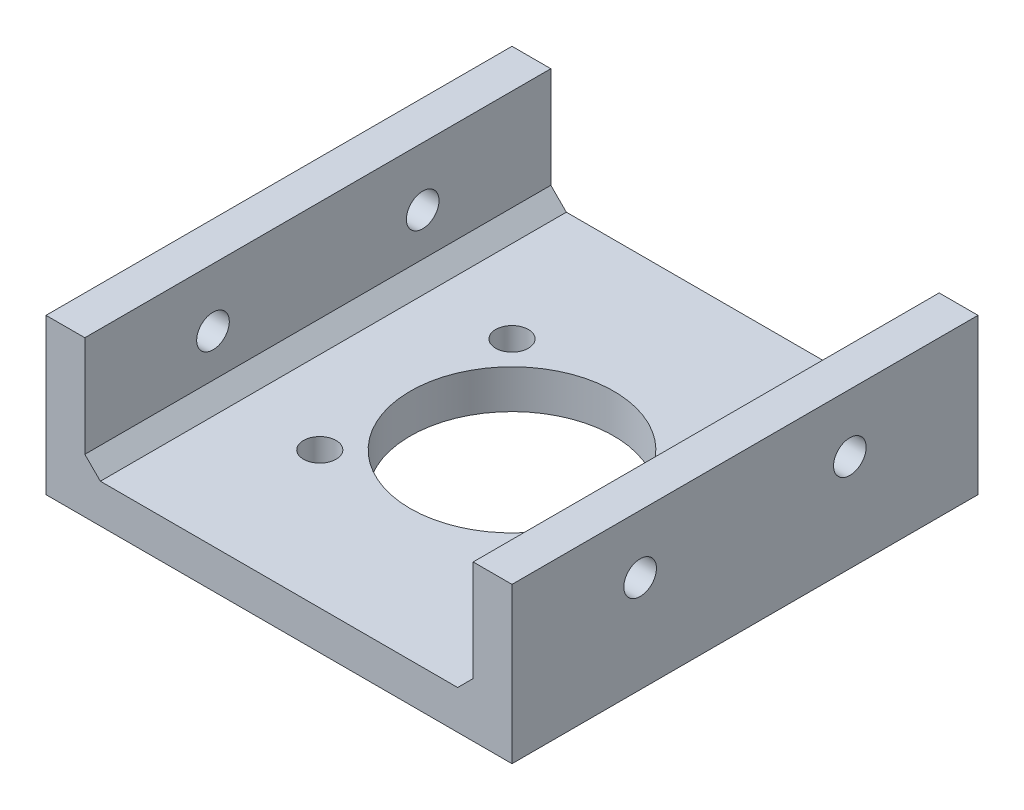
ISO-10303-21;
HEADER;
FILE_DESCRIPTION(('STEP AP214'),'2;1');
FILE_NAME('part.step','',(''),(''),'','','');
FILE_SCHEMA(('AUTOMOTIVE_DESIGN { 1 0 10303 214 1 1 1 1 }'));
ENDSEC;
DATA;
#1=APPLICATION_CONTEXT('core data for automotive mechanical design processes');
#2=APPLICATION_PROTOCOL_DEFINITION('international standard','automotive_design',2000,#1);
#3=PRODUCT_CONTEXT('',#1,'mechanical');
#4=PRODUCT('Part','Part','',(#3));
#5=PRODUCT_RELATED_PRODUCT_CATEGORY('part','',(#4));
#6=PRODUCT_DEFINITION_FORMATION('','',#4);
#7=PRODUCT_DEFINITION_CONTEXT('part definition',#1,'design');
#8=PRODUCT_DEFINITION('design','',#6,#7);
#9=PRODUCT_DEFINITION_SHAPE('','',#8);
#10=(LENGTH_UNIT() NAMED_UNIT(*) SI_UNIT(.MILLI.,.METRE.));
#11=(NAMED_UNIT(*) PLANE_ANGLE_UNIT() SI_UNIT($,.RADIAN.));
#12=(NAMED_UNIT(*) SI_UNIT($,.STERADIAN.) SOLID_ANGLE_UNIT());
#13=UNCERTAINTY_MEASURE_WITH_UNIT(LENGTH_MEASURE(1.E-05),#10,'distance_accuracy_value','');
#14=(GEOMETRIC_REPRESENTATION_CONTEXT(3) GLOBAL_UNCERTAINTY_ASSIGNED_CONTEXT((#13)) GLOBAL_UNIT_ASSIGNED_CONTEXT((#10,
#11,#12)) REPRESENTATION_CONTEXT('',''));
#15=CARTESIAN_POINT('',(0.,0.,0.));
#16=DIRECTION('',(0.,0.,1.));
#17=DIRECTION('',(1.,0.,0.));
#18=AXIS2_PLACEMENT_3D('',#15,#16,#17);
#19=CARTESIAN_POINT('',(0.,5.,0.));
#20=DIRECTION('',(0.,-1.,0.));
#21=DIRECTION('',(0.,0.,-1.));
#22=AXIS2_PLACEMENT_3D('',#19,#20,#21);
#23=PLANE('',#22);
#24=CARTESIAN_POINT('',(0.,5.,0.));
#25=DIRECTION('',(0.,1.,0.));
#26=DIRECTION('',(0.,0.,1.));
#27=AXIS2_PLACEMENT_3D('',#24,#25,#26);
#28=CIRCLE('',#27,13.1);
#29=CARTESIAN_POINT('',(0.,5.,13.1));
#30=VERTEX_POINT('',#29);
#31=EDGE_CURVE('E190',#30,#30,#28,.T.);
#32=ORIENTED_EDGE('',*,*,#31,.F.);
#33=EDGE_LOOP('',(#32));
#34=FACE_BOUND('',#33,.T.);
#35=CARTESIAN_POINT('',(-12.3743686707645,5.,12.3743686707647));
#36=DIRECTION('',(0.,1.,0.));
#37=DIRECTION('',(0.,0.,1.));
#38=AXIS2_PLACEMENT_3D('',#35,#36,#37);
#39=CIRCLE('',#38,2.1);
#40=CARTESIAN_POINT('',(-12.3743686707645,5.,14.4743686707647));
#41=VERTEX_POINT('',#40);
#42=EDGE_CURVE('E184',#41,#41,#39,.T.);
#43=ORIENTED_EDGE('',*,*,#42,.F.);
#44=EDGE_LOOP('',(#43));
#45=FACE_BOUND('',#44,.T.);
#46=CARTESIAN_POINT('',(12.3743686707645,5.,12.3743686707647));
#47=DIRECTION('',(0.,1.,0.));
#48=DIRECTION('',(0.,0.,-1.));
#49=AXIS2_PLACEMENT_3D('',#46,#47,#48);
#50=CIRCLE('',#49,2.1);
#51=CARTESIAN_POINT('',(12.3743686707645,5.,10.2743686707647));
#52=VERTEX_POINT('',#51);
#53=EDGE_CURVE('E178',#52,#52,#50,.T.);
#54=ORIENTED_EDGE('',*,*,#53,.F.);
#55=EDGE_LOOP('',(#54));
#56=FACE_BOUND('',#55,.T.);
#57=CARTESIAN_POINT('',(-12.3743686707645,5.,-12.3743686707647));
#58=DIRECTION('',(0.,1.,0.));
#59=DIRECTION('',(0.,0.,-1.));
#60=AXIS2_PLACEMENT_3D('',#57,#58,#59);
#61=CIRCLE('',#60,2.1);
#62=CARTESIAN_POINT('',(-12.3743686707645,5.,-14.4743686707647));
#63=VERTEX_POINT('',#62);
#64=EDGE_CURVE('E172',#63,#63,#61,.T.);
#65=ORIENTED_EDGE('',*,*,#64,.F.);
#66=EDGE_LOOP('',(#65));
#67=FACE_BOUND('',#66,.T.);
#68=CARTESIAN_POINT('',(12.3743686707645,5.,-12.3743686707647));
#69=DIRECTION('',(0.,1.,0.));
#70=DIRECTION('',(0.,0.,1.));
#71=AXIS2_PLACEMENT_3D('',#68,#69,#70);
#72=CIRCLE('',#71,2.1);
#73=CARTESIAN_POINT('',(12.3743686707645,5.,-10.2743686707647));
#74=VERTEX_POINT('',#73);
#75=EDGE_CURVE('E166',#74,#74,#72,.T.);
#76=ORIENTED_EDGE('',*,*,#75,.F.);
#77=EDGE_LOOP('',(#76));
#78=FACE_BOUND('',#77,.T.);
#79=DIRECTION('',(1.,0.,0.));
#80=VECTOR('',#79,1.);
#81=CARTESIAN_POINT('',(-30.,5.,30.));
#82=LINE('',#81,#80);
#83=CARTESIAN_POINT('',(-23.,5.,30.));
#84=VERTEX_POINT('',#83);
#85=CARTESIAN_POINT('',(23.,5.,30.));
#86=VERTEX_POINT('',#85);
#87=EDGE_CURVE('E198',#84,#86,#82,.T.);
#88=ORIENTED_EDGE('',*,*,#87,.T.);
#89=DIRECTION('',(0.,0.,-1.));
#90=VECTOR('',#89,1.);
#91=CARTESIAN_POINT('',(23.,5.,-30.));
#92=LINE('',#91,#90);
#93=CARTESIAN_POINT('',(23.,5.,-30.));
#94=VERTEX_POINT('',#93);
#95=EDGE_CURVE('E227',#86,#94,#92,.T.);
#96=ORIENTED_EDGE('',*,*,#95,.T.);
#97=DIRECTION('',(-1.,0.,0.));
#98=VECTOR('',#97,1.);
#99=CARTESIAN_POINT('',(-30.,5.,-30.));
#100=LINE('',#99,#98);
#101=CARTESIAN_POINT('',(-23.,5.,-30.));
#102=VERTEX_POINT('',#101);
#103=EDGE_CURVE('E195',#94,#102,#100,.T.);
#104=ORIENTED_EDGE('',*,*,#103,.T.);
#105=DIRECTION('',(0.,0.,1.));
#106=VECTOR('',#105,1.);
#107=CARTESIAN_POINT('',(-23.,5.,30.));
#108=LINE('',#107,#106);
#109=EDGE_CURVE('E225',#102,#84,#108,.T.);
#110=ORIENTED_EDGE('',*,*,#109,.T.);
#111=EDGE_LOOP('',(#88,#96,#104,#110));
#112=FACE_BOUND('',#111,.T.);
#113=ADVANCED_FACE('F34',(#34,#45,#56,#67,#78,#112),#23,.F.);
#114=CARTESIAN_POINT('',(0.,0.,0.));
#115=DIRECTION('',(0.,-1.,0.));
#116=DIRECTION('',(0.,0.,-1.));
#117=AXIS2_PLACEMENT_3D('',#114,#115,#116);
#118=PLANE('',#117);
#119=CARTESIAN_POINT('',(-12.3743686707645,0.,-12.3743686707647));
#120=DIRECTION('',(0.,1.,0.));
#121=DIRECTION('',(0.,0.,-1.));
#122=AXIS2_PLACEMENT_3D('',#119,#120,#121);
#123=CIRCLE('',#122,2.1);
#124=CARTESIAN_POINT('',(-12.3743686707645,0.,-14.4743686707647));
#125=VERTEX_POINT('',#124);
#126=EDGE_CURVE('E169',#125,#125,#123,.T.);
#127=ORIENTED_EDGE('',*,*,#126,.T.);
#128=EDGE_LOOP('',(#127));
#129=FACE_BOUND('',#128,.T.);
#130=CARTESIAN_POINT('',(-12.3743686707645,0.,12.3743686707647));
#131=DIRECTION('',(0.,1.,0.));
#132=DIRECTION('',(0.,0.,1.));
#133=AXIS2_PLACEMENT_3D('',#130,#131,#132);
#134=CIRCLE('',#133,2.1);
#135=CARTESIAN_POINT('',(-12.3743686707645,0.,14.4743686707647));
#136=VERTEX_POINT('',#135);
#137=EDGE_CURVE('E181',#136,#136,#134,.T.);
#138=ORIENTED_EDGE('',*,*,#137,.T.);
#139=EDGE_LOOP('',(#138));
#140=FACE_BOUND('',#139,.T.);
#141=DIRECTION('',(0.,0.,-1.));
#142=VECTOR('',#141,1.);
#143=CARTESIAN_POINT('',(30.,0.,30.));
#144=LINE('',#143,#142);
#145=CARTESIAN_POINT('',(30.,0.,30.));
#146=VERTEX_POINT('',#145);
#147=CARTESIAN_POINT('',(30.,0.,-30.));
#148=VERTEX_POINT('',#147);
#149=EDGE_CURVE('E119',#146,#148,#144,.T.);
#150=ORIENTED_EDGE('',*,*,#149,.F.);
#151=DIRECTION('',(1.,0.,0.));
#152=VECTOR('',#151,1.);
#153=CARTESIAN_POINT('',(-30.,0.,30.));
#154=LINE('',#153,#152);
#155=CARTESIAN_POINT('',(-30.,0.,30.));
#156=VERTEX_POINT('',#155);
#157=EDGE_CURVE('E199',#156,#146,#154,.T.);
#158=ORIENTED_EDGE('',*,*,#157,.F.);
#159=DIRECTION('',(0.,0.,1.));
#160=VECTOR('',#159,1.);
#161=CARTESIAN_POINT('',(-30.,0.,30.));
#162=LINE('',#161,#160);
#163=CARTESIAN_POINT('',(-30.,0.,-30.));
#164=VERTEX_POINT('',#163);
#165=EDGE_CURVE('E206',#164,#156,#162,.T.);
#166=ORIENTED_EDGE('',*,*,#165,.F.);
#167=DIRECTION('',(-1.,0.,0.));
#168=VECTOR('',#167,1.);
#169=CARTESIAN_POINT('',(-30.,0.,-30.));
#170=LINE('',#169,#168);
#171=EDGE_CURVE('E204',#148,#164,#170,.T.);
#172=ORIENTED_EDGE('',*,*,#171,.F.);
#173=EDGE_LOOP('',(#150,#158,#166,#172));
#174=FACE_BOUND('',#173,.T.);
#175=CARTESIAN_POINT('',(0.,0.,0.));
#176=DIRECTION('',(0.,1.,0.));
#177=DIRECTION('',(0.,0.,1.));
#178=AXIS2_PLACEMENT_3D('',#175,#176,#177);
#179=CIRCLE('',#178,13.1);
#180=CARTESIAN_POINT('',(0.,0.,13.1));
#181=VERTEX_POINT('',#180);
#182=EDGE_CURVE('E187',#181,#181,#179,.T.);
#183=ORIENTED_EDGE('',*,*,#182,.T.);
#184=EDGE_LOOP('',(#183));
#185=FACE_BOUND('',#184,.T.);
#186=CARTESIAN_POINT('',(12.3743686707645,0.,12.3743686707647));
#187=DIRECTION('',(0.,1.,0.));
#188=DIRECTION('',(0.,0.,-1.));
#189=AXIS2_PLACEMENT_3D('',#186,#187,#188);
#190=CIRCLE('',#189,2.1);
#191=CARTESIAN_POINT('',(12.3743686707645,0.,10.2743686707647));
#192=VERTEX_POINT('',#191);
#193=EDGE_CURVE('E175',#192,#192,#190,.T.);
#194=ORIENTED_EDGE('',*,*,#193,.T.);
#195=EDGE_LOOP('',(#194));
#196=FACE_BOUND('',#195,.T.);
#197=CARTESIAN_POINT('',(12.3743686707645,0.,-12.3743686707647));
#198=DIRECTION('',(0.,1.,0.));
#199=DIRECTION('',(0.,0.,1.));
#200=AXIS2_PLACEMENT_3D('',#197,#198,#199);
#201=CIRCLE('',#200,2.1);
#202=CARTESIAN_POINT('',(12.3743686707645,0.,-10.2743686707647));
#203=VERTEX_POINT('',#202);
#204=EDGE_CURVE('E165',#203,#203,#201,.T.);
#205=ORIENTED_EDGE('',*,*,#204,.T.);
#206=EDGE_LOOP('',(#205));
#207=FACE_BOUND('',#206,.T.);
#208=ADVANCED_FACE('F253',(#129,#140,#174,#185,#196,#207),#118,.T.);
#209=CARTESIAN_POINT('',(30.,5.,30.));
#210=DIRECTION('',(-1.,0.,0.));
#211=DIRECTION('',(0.,0.,1.));
#212=AXIS2_PLACEMENT_3D('',#209,#210,#211);
#213=PLANE('',#212);
#214=CARTESIAN_POINT('',(30.,12.5,-13.5));
#215=DIRECTION('',(-1.,0.,0.));
#216=DIRECTION('',(0.,0.,1.));
#217=AXIS2_PLACEMENT_3D('',#214,#215,#216);
#218=CIRCLE('',#217,2.1);
#219=CARTESIAN_POINT('',(30.,12.5,-11.4));
#220=VERTEX_POINT('',#219);
#221=EDGE_CURVE('E222',#220,#220,#218,.T.);
#222=ORIENTED_EDGE('',*,*,#221,.T.);
#223=EDGE_LOOP('',(#222));
#224=FACE_BOUND('',#223,.T.);
#225=CARTESIAN_POINT('',(30.,12.5,13.5));
#226=DIRECTION('',(-1.,0.,0.));
#227=DIRECTION('',(0.,0.,-1.));
#228=AXIS2_PLACEMENT_3D('',#225,#226,#227);
#229=CIRCLE('',#228,2.1);
#230=CARTESIAN_POINT('',(30.,12.5,11.4));
#231=VERTEX_POINT('',#230);
#232=EDGE_CURVE('E217',#231,#231,#229,.T.);
#233=ORIENTED_EDGE('',*,*,#232,.T.);
#234=EDGE_LOOP('',(#233));
#235=FACE_BOUND('',#234,.T.);
#236=ORIENTED_EDGE('',*,*,#149,.T.);
#237=DIRECTION('',(0.,-1.,0.));
#238=VECTOR('',#237,1.);
#239=CARTESIAN_POINT('',(30.,5.,-30.));
#240=LINE('',#239,#238);
#241=CARTESIAN_POINT('',(30.,20.,-30.));
#242=VERTEX_POINT('',#241);
#243=EDGE_CURVE('E112',#242,#148,#240,.T.);
#244=ORIENTED_EDGE('',*,*,#243,.F.);
#245=DIRECTION('',(0.,0.,-1.));
#246=VECTOR('',#245,1.);
#247=CARTESIAN_POINT('',(30.,20.,-30.));
#248=LINE('',#247,#246);
#249=CARTESIAN_POINT('',(30.,20.,30.));
#250=VERTEX_POINT('',#249);
#251=EDGE_CURVE('E117',#250,#242,#248,.T.);
#252=ORIENTED_EDGE('',*,*,#251,.F.);
#253=DIRECTION('',(0.,-1.,0.));
#254=VECTOR('',#253,1.);
#255=CARTESIAN_POINT('',(30.,5.,30.));
#256=LINE('',#255,#254);
#257=EDGE_CURVE('E202',#250,#146,#256,.T.);
#258=ORIENTED_EDGE('',*,*,#257,.T.);
#259=EDGE_LOOP('',(#236,#244,#252,#258));
#260=FACE_BOUND('',#259,.T.);
#261=ADVANCED_FACE('F114',(#224,#235,#260),#213,.F.);
#262=CARTESIAN_POINT('',(-30.,5.,-30.));
#263=DIRECTION('',(0.,0.,1.));
#264=DIRECTION('',(1.,0.,0.));
#265=AXIS2_PLACEMENT_3D('',#262,#263,#264);
#266=PLANE('',#265);
#267=ORIENTED_EDGE('',*,*,#171,.T.);
#268=DIRECTION('',(0.,-1.,0.));
#269=VECTOR('',#268,1.);
#270=CARTESIAN_POINT('',(-30.,5.,-30.));
#271=LINE('',#270,#269);
#272=CARTESIAN_POINT('',(-30.,20.,-30.));
#273=VERTEX_POINT('',#272);
#274=EDGE_CURVE('E122',#273,#164,#271,.T.);
#275=ORIENTED_EDGE('',*,*,#274,.F.);
#276=DIRECTION('',(-1.,0.,0.));
#277=VECTOR('',#276,1.);
#278=CARTESIAN_POINT('',(-30.,20.,-30.));
#279=LINE('',#278,#277);
#280=CARTESIAN_POINT('',(-25.,20.,-30.));
#281=VERTEX_POINT('',#280);
#282=EDGE_CURVE('E157',#281,#273,#279,.T.);
#283=ORIENTED_EDGE('',*,*,#282,.F.);
#284=DIRECTION('',(0.,-1.,0.));
#285=VECTOR('',#284,1.);
#286=CARTESIAN_POINT('',(-25.,20.,-30.));
#287=LINE('',#286,#285);
#288=CARTESIAN_POINT('',(-25.,6.99999999999999,-30.));
#289=VERTEX_POINT('',#288);
#290=EDGE_CURVE('E160',#281,#289,#287,.T.);
#291=ORIENTED_EDGE('',*,*,#290,.T.);
#292=DIRECTION('',(-0.707106781186549,0.707106781186546,0.));
#293=VECTOR('',#292,1.);
#294=CARTESIAN_POINT('',(-26.5,8.5,-30.));
#295=LINE('',#294,#293);
#296=EDGE_CURVE('E42',#289,#102,#295,.F.);
#297=ORIENTED_EDGE('',*,*,#296,.T.);
#298=ORIENTED_EDGE('',*,*,#103,.F.);
#299=DIRECTION('',(-0.707106781186548,-0.707106781186547,0.));
#300=VECTOR('',#299,1.);
#301=CARTESIAN_POINT('',(-3.50000000000001,-21.5,-30.));
#302=LINE('',#301,#300);
#303=CARTESIAN_POINT('',(25.,7.,-30.));
#304=VERTEX_POINT('',#303);
#305=EDGE_CURVE('E233',#94,#304,#302,.F.);
#306=ORIENTED_EDGE('',*,*,#305,.T.);
#307=DIRECTION('',(0.,-1.,0.));
#308=VECTOR('',#307,1.);
#309=CARTESIAN_POINT('',(25.,20.,-30.));
#310=LINE('',#309,#308);
#311=CARTESIAN_POINT('',(25.,20.,-30.));
#312=VERTEX_POINT('',#311);
#313=EDGE_CURVE('E128',#312,#304,#310,.T.);
#314=ORIENTED_EDGE('',*,*,#313,.F.);
#315=DIRECTION('',(-1.,0.,0.));
#316=VECTOR('',#315,1.);
#317=CARTESIAN_POINT('',(30.,20.,-30.));
#318=LINE('',#317,#316);
#319=EDGE_CURVE('E125',#242,#312,#318,.T.);
#320=ORIENTED_EDGE('',*,*,#319,.F.);
#321=ORIENTED_EDGE('',*,*,#243,.T.);
#322=EDGE_LOOP('',(#267,#275,#283,#291,#297,#298,#306,#314,#320,#321));
#323=FACE_BOUND('',#322,.T.);
#324=ADVANCED_FACE('F126',(#323),#266,.F.);
#325=CARTESIAN_POINT('',(-30.,5.,30.));
#326=DIRECTION('',(1.,0.,0.));
#327=DIRECTION('',(0.,0.,-1.));
#328=AXIS2_PLACEMENT_3D('',#325,#326,#327);
#329=PLANE('',#328);
#330=CARTESIAN_POINT('',(-30.,12.5,-13.5));
#331=DIRECTION('',(-1.,0.,0.));
#332=DIRECTION('',(0.,0.,1.));
#333=AXIS2_PLACEMENT_3D('',#330,#331,#332);
#334=CIRCLE('',#333,2.1);
#335=CARTESIAN_POINT('',(-30.,12.5,-11.4));
#336=VERTEX_POINT('',#335);
#337=EDGE_CURVE('E307',#336,#336,#334,.T.);
#338=ORIENTED_EDGE('',*,*,#337,.F.);
#339=EDGE_LOOP('',(#338));
#340=FACE_BOUND('',#339,.T.);
#341=CARTESIAN_POINT('',(-30.,12.5,13.5));
#342=DIRECTION('',(-1.,0.,0.));
#343=DIRECTION('',(0.,0.,-1.));
#344=AXIS2_PLACEMENT_3D('',#341,#342,#343);
#345=CIRCLE('',#344,2.1);
#346=CARTESIAN_POINT('',(-30.,12.5,11.4));
#347=VERTEX_POINT('',#346);
#348=EDGE_CURVE('E301',#347,#347,#345,.T.);
#349=ORIENTED_EDGE('',*,*,#348,.F.);
#350=EDGE_LOOP('',(#349));
#351=FACE_BOUND('',#350,.T.);
#352=ORIENTED_EDGE('',*,*,#165,.T.);
#353=DIRECTION('',(0.,-1.,0.));
#354=VECTOR('',#353,1.);
#355=CARTESIAN_POINT('',(-30.,5.,30.));
#356=LINE('',#355,#354);
#357=CARTESIAN_POINT('',(-30.,20.,30.));
#358=VERTEX_POINT('',#357);
#359=EDGE_CURVE('E210',#358,#156,#356,.T.);
#360=ORIENTED_EDGE('',*,*,#359,.F.);
#361=DIRECTION('',(0.,0.,1.));
#362=VECTOR('',#361,1.);
#363=CARTESIAN_POINT('',(-30.,20.,-30.));
#364=LINE('',#363,#362);
#365=EDGE_CURVE('E150',#273,#358,#364,.T.);
#366=ORIENTED_EDGE('',*,*,#365,.F.);
#367=ORIENTED_EDGE('',*,*,#274,.T.);
#368=EDGE_LOOP('',(#352,#360,#366,#367));
#369=FACE_BOUND('',#368,.T.);
#370=ADVANCED_FACE('F250',(#340,#351,#369),#329,.F.);
#371=CARTESIAN_POINT('',(-30.,5.,30.));
#372=DIRECTION('',(0.,0.,-1.));
#373=DIRECTION('',(-1.,0.,0.));
#374=AXIS2_PLACEMENT_3D('',#371,#372,#373);
#375=PLANE('',#374);
#376=ORIENTED_EDGE('',*,*,#157,.T.);
#377=ORIENTED_EDGE('',*,*,#257,.F.);
#378=DIRECTION('',(1.,0.,0.));
#379=VECTOR('',#378,1.);
#380=CARTESIAN_POINT('',(30.,20.,30.));
#381=LINE('',#380,#379);
#382=CARTESIAN_POINT('',(25.,20.,30.));
#383=VERTEX_POINT('',#382);
#384=EDGE_CURVE('E136',#383,#250,#381,.T.);
#385=ORIENTED_EDGE('',*,*,#384,.F.);
#386=DIRECTION('',(0.,-1.,0.));
#387=VECTOR('',#386,1.);
#388=CARTESIAN_POINT('',(25.,20.,30.));
#389=LINE('',#388,#387);
#390=CARTESIAN_POINT('',(25.,7.,30.));
#391=VERTEX_POINT('',#390);
#392=EDGE_CURVE('E146',#383,#391,#389,.T.);
#393=ORIENTED_EDGE('',*,*,#392,.T.);
#394=DIRECTION('',(0.707106781186548,0.707106781186547,0.));
#395=VECTOR('',#394,1.);
#396=CARTESIAN_POINT('',(-3.50000000000001,-21.5,30.));
#397=LINE('',#396,#395);
#398=EDGE_CURVE('E231',#391,#86,#397,.F.);
#399=ORIENTED_EDGE('',*,*,#398,.T.);
#400=ORIENTED_EDGE('',*,*,#87,.F.);
#401=DIRECTION('',(0.707106781186549,-0.707106781186546,0.));
#402=VECTOR('',#401,1.);
#403=CARTESIAN_POINT('',(-26.5,8.5,30.));
#404=LINE('',#403,#402);
#405=CARTESIAN_POINT('',(-25.,6.99999999999999,30.));
#406=VERTEX_POINT('',#405);
#407=EDGE_CURVE('E11',#84,#406,#404,.F.);
#408=ORIENTED_EDGE('',*,*,#407,.T.);
#409=DIRECTION('',(0.,-1.,0.));
#410=VECTOR('',#409,1.);
#411=CARTESIAN_POINT('',(-25.,20.,30.));
#412=LINE('',#411,#410);
#413=CARTESIAN_POINT('',(-25.,20.,30.));
#414=VERTEX_POINT('',#413);
#415=EDGE_CURVE('E163',#414,#406,#412,.T.);
#416=ORIENTED_EDGE('',*,*,#415,.F.);
#417=DIRECTION('',(1.,0.,0.));
#418=VECTOR('',#417,1.);
#419=CARTESIAN_POINT('',(-30.,20.,30.));
#420=LINE('',#419,#418);
#421=EDGE_CURVE('E153',#358,#414,#420,.T.);
#422=ORIENTED_EDGE('',*,*,#421,.F.);
#423=ORIENTED_EDGE('',*,*,#359,.T.);
#424=EDGE_LOOP('',(#376,#377,#385,#393,#399,#400,#408,#416,#422,#423));
#425=FACE_BOUND('',#424,.T.);
#426=ADVANCED_FACE('F244',(#425),#375,.F.);
#427=CARTESIAN_POINT('',(0.,5.,0.));
#428=DIRECTION('',(0.,-1.,0.));
#429=DIRECTION('',(0.,0.,-1.));
#430=AXIS2_PLACEMENT_3D('',#427,#428,#429);
#431=CYLINDRICAL_SURFACE('',#430,13.1);
#432=ORIENTED_EDGE('',*,*,#31,.T.);
#433=EDGE_LOOP('',(#432));
#434=FACE_BOUND('',#433,.T.);
#435=ORIENTED_EDGE('',*,*,#182,.F.);
#436=EDGE_LOOP('',(#435));
#437=FACE_BOUND('',#436,.T.);
#438=ADVANCED_FACE('F282',(#434,#437),#431,.F.);
#439=CARTESIAN_POINT('',(-12.3743686707645,5.,12.3743686707647));
#440=DIRECTION('',(0.,-1.,0.));
#441=DIRECTION('',(0.,0.,-1.));
#442=AXIS2_PLACEMENT_3D('',#439,#440,#441);
#443=CYLINDRICAL_SURFACE('',#442,2.1);
#444=ORIENTED_EDGE('',*,*,#42,.T.);
#445=EDGE_LOOP('',(#444));
#446=FACE_BOUND('',#445,.T.);
#447=ORIENTED_EDGE('',*,*,#137,.F.);
#448=EDGE_LOOP('',(#447));
#449=FACE_BOUND('',#448,.T.);
#450=ADVANCED_FACE('F341',(#446,#449),#443,.F.);
#451=CARTESIAN_POINT('',(12.3743686707645,5.,12.3743686707647));
#452=DIRECTION('',(0.,-1.,0.));
#453=DIRECTION('',(0.,0.,-1.));
#454=AXIS2_PLACEMENT_3D('',#451,#452,#453);
#455=CYLINDRICAL_SURFACE('',#454,2.1);
#456=ORIENTED_EDGE('',*,*,#53,.T.);
#457=EDGE_LOOP('',(#456));
#458=FACE_BOUND('',#457,.T.);
#459=ORIENTED_EDGE('',*,*,#193,.F.);
#460=EDGE_LOOP('',(#459));
#461=FACE_BOUND('',#460,.T.);
#462=ADVANCED_FACE('F338',(#458,#461),#455,.F.);
#463=CARTESIAN_POINT('',(-12.3743686707645,5.,-12.3743686707647));
#464=DIRECTION('',(0.,-1.,0.));
#465=DIRECTION('',(0.,0.,-1.));
#466=AXIS2_PLACEMENT_3D('',#463,#464,#465);
#467=CYLINDRICAL_SURFACE('',#466,2.1);
#468=ORIENTED_EDGE('',*,*,#64,.T.);
#469=EDGE_LOOP('',(#468));
#470=FACE_BOUND('',#469,.T.);
#471=ORIENTED_EDGE('',*,*,#126,.F.);
#472=EDGE_LOOP('',(#471));
#473=FACE_BOUND('',#472,.T.);
#474=ADVANCED_FACE('F331',(#470,#473),#467,.F.);
#475=CARTESIAN_POINT('',(12.3743686707645,5.,-12.3743686707647));
#476=DIRECTION('',(0.,-1.,0.));
#477=DIRECTION('',(0.,0.,-1.));
#478=AXIS2_PLACEMENT_3D('',#475,#476,#477);
#479=CYLINDRICAL_SURFACE('',#478,2.1);
#480=ORIENTED_EDGE('',*,*,#75,.T.);
#481=EDGE_LOOP('',(#480));
#482=FACE_BOUND('',#481,.T.);
#483=ORIENTED_EDGE('',*,*,#204,.F.);
#484=EDGE_LOOP('',(#483));
#485=FACE_BOUND('',#484,.T.);
#486=ADVANCED_FACE('F323',(#482,#485),#479,.F.);
#487=CARTESIAN_POINT('',(-25.,20.,-30.));
#488=DIRECTION('',(-1.,0.,0.));
#489=DIRECTION('',(0.,0.,1.));
#490=AXIS2_PLACEMENT_3D('',#487,#488,#489);
#491=PLANE('',#490);
#492=CARTESIAN_POINT('',(-25.,12.5,-13.5));
#493=DIRECTION('',(-1.,0.,0.));
#494=DIRECTION('',(0.,0.,1.));
#495=AXIS2_PLACEMENT_3D('',#492,#493,#494);
#496=CIRCLE('',#495,2.1);
#497=CARTESIAN_POINT('',(-25.,12.5,-11.4));
#498=VERTEX_POINT('',#497);
#499=EDGE_CURVE('E221',#498,#498,#496,.T.);
#500=ORIENTED_EDGE('',*,*,#499,.T.);
#501=EDGE_LOOP('',(#500));
#502=FACE_BOUND('',#501,.T.);
#503=CARTESIAN_POINT('',(-25.,12.5,13.5));
#504=DIRECTION('',(-1.,0.,0.));
#505=DIRECTION('',(0.,0.,1.));
#506=AXIS2_PLACEMENT_3D('',#503,#504,#505);
#507=CIRCLE('',#506,2.1);
#508=CARTESIAN_POINT('',(-25.,12.5,15.6));
#509=VERTEX_POINT('',#508);
#510=EDGE_CURVE('E137',#509,#509,#507,.T.);
#511=ORIENTED_EDGE('',*,*,#510,.T.);
#512=EDGE_LOOP('',(#511));
#513=FACE_BOUND('',#512,.T.);
#514=ORIENTED_EDGE('',*,*,#415,.T.);
#515=DIRECTION('',(0.,0.,-1.));
#516=VECTOR('',#515,1.);
#517=CARTESIAN_POINT('',(-25.,6.99999999999999,-30.));
#518=LINE('',#517,#516);
#519=EDGE_CURVE('E229',#406,#289,#518,.T.);
#520=ORIENTED_EDGE('',*,*,#519,.T.);
#521=ORIENTED_EDGE('',*,*,#290,.F.);
#522=DIRECTION('',(0.,0.,-1.));
#523=VECTOR('',#522,1.);
#524=CARTESIAN_POINT('',(-25.,20.,-30.));
#525=LINE('',#524,#523);
#526=EDGE_CURVE('E155',#414,#281,#525,.T.);
#527=ORIENTED_EDGE('',*,*,#526,.F.);
#528=EDGE_LOOP('',(#514,#520,#521,#527));
#529=FACE_BOUND('',#528,.T.);
#530=ADVANCED_FACE('F241',(#502,#513,#529),#491,.F.);
#531=CARTESIAN_POINT('',(0.,20.,0.));
#532=DIRECTION('',(0.,1.,0.));
#533=DIRECTION('',(0.,0.,1.));
#534=AXIS2_PLACEMENT_3D('',#531,#532,#533);
#535=PLANE('',#534);
#536=ORIENTED_EDGE('',*,*,#365,.T.);
#537=ORIENTED_EDGE('',*,*,#421,.T.);
#538=ORIENTED_EDGE('',*,*,#526,.T.);
#539=ORIENTED_EDGE('',*,*,#282,.T.);
#540=EDGE_LOOP('',(#536,#537,#538,#539));
#541=FACE_BOUND('',#540,.T.);
#542=ADVANCED_FACE('F248',(#541),#535,.T.);
#543=CARTESIAN_POINT('',(25.,20.,-30.));
#544=DIRECTION('',(1.,0.,0.));
#545=DIRECTION('',(0.,0.,-1.));
#546=AXIS2_PLACEMENT_3D('',#543,#544,#545);
#547=PLANE('',#546);
#548=CARTESIAN_POINT('',(25.,12.5,-13.5));
#549=DIRECTION('',(1.,0.,0.));
#550=DIRECTION('',(0.,0.,-1.));
#551=AXIS2_PLACEMENT_3D('',#548,#549,#550);
#552=CIRCLE('',#551,2.1);
#553=CARTESIAN_POINT('',(25.,12.5,-15.6));
#554=VERTEX_POINT('',#553);
#555=EDGE_CURVE('E218',#554,#554,#552,.T.);
#556=ORIENTED_EDGE('',*,*,#555,.T.);
#557=EDGE_LOOP('',(#556));
#558=FACE_BOUND('',#557,.T.);
#559=CARTESIAN_POINT('',(25.,12.5,13.5));
#560=DIRECTION('',(1.,0.,0.));
#561=DIRECTION('',(0.,0.,-1.));
#562=AXIS2_PLACEMENT_3D('',#559,#560,#561);
#563=CIRCLE('',#562,2.1);
#564=CARTESIAN_POINT('',(25.,12.5,11.4));
#565=VERTEX_POINT('',#564);
#566=EDGE_CURVE('E140',#565,#565,#563,.T.);
#567=ORIENTED_EDGE('',*,*,#566,.T.);
#568=EDGE_LOOP('',(#567));
#569=FACE_BOUND('',#568,.T.);
#570=ORIENTED_EDGE('',*,*,#313,.T.);
#571=DIRECTION('',(0.,0.,1.));
#572=VECTOR('',#571,1.);
#573=CARTESIAN_POINT('',(25.,7.,30.));
#574=LINE('',#573,#572);
#575=EDGE_CURVE('E121',#304,#391,#574,.T.);
#576=ORIENTED_EDGE('',*,*,#575,.T.);
#577=ORIENTED_EDGE('',*,*,#392,.F.);
#578=DIRECTION('',(0.,0.,1.));
#579=VECTOR('',#578,1.);
#580=CARTESIAN_POINT('',(25.,20.,-30.));
#581=LINE('',#580,#579);
#582=EDGE_CURVE('E131',#312,#383,#581,.T.);
#583=ORIENTED_EDGE('',*,*,#582,.F.);
#584=EDGE_LOOP('',(#570,#576,#577,#583));
#585=FACE_BOUND('',#584,.T.);
#586=ADVANCED_FACE('F257',(#558,#569,#585),#547,.F.);
#587=CARTESIAN_POINT('',(0.,20.,0.));
#588=DIRECTION('',(0.,-1.,0.));
#589=DIRECTION('',(0.,0.,-1.));
#590=AXIS2_PLACEMENT_3D('',#587,#588,#589);
#591=PLANE('',#590);
#592=ORIENTED_EDGE('',*,*,#251,.T.);
#593=ORIENTED_EDGE('',*,*,#319,.T.);
#594=ORIENTED_EDGE('',*,*,#582,.T.);
#595=ORIENTED_EDGE('',*,*,#384,.T.);
#596=EDGE_LOOP('',(#592,#593,#594,#595));
#597=FACE_BOUND('',#596,.T.);
#598=ADVANCED_FACE('F134',(#597),#591,.F.);
#599=CARTESIAN_POINT('',(30.,12.5,13.5));
#600=DIRECTION('',(-1.,0.,0.));
#601=DIRECTION('',(0.,0.,1.));
#602=AXIS2_PLACEMENT_3D('',#599,#600,#601);
#603=CYLINDRICAL_SURFACE('',#602,2.1);
#604=ORIENTED_EDGE('',*,*,#232,.F.);
#605=EDGE_LOOP('',(#604));
#606=FACE_BOUND('',#605,.T.);
#607=ORIENTED_EDGE('',*,*,#566,.F.);
#608=EDGE_LOOP('',(#607));
#609=FACE_BOUND('',#608,.T.);
#610=ADVANCED_FACE('F318',(#606,#609),#603,.F.);
#611=ORIENTED_EDGE('',*,*,#348,.T.);
#612=EDGE_LOOP('',(#611));
#613=FACE_BOUND('',#612,.T.);
#614=ORIENTED_EDGE('',*,*,#510,.F.);
#615=EDGE_LOOP('',(#614));
#616=FACE_BOUND('',#615,.T.);
#617=ADVANCED_FACE('F315',(#613,#616),#603,.F.);
#618=CARTESIAN_POINT('',(30.,12.5,-13.5));
#619=DIRECTION('',(-1.,0.,0.));
#620=DIRECTION('',(0.,0.,1.));
#621=AXIS2_PLACEMENT_3D('',#618,#619,#620);
#622=CYLINDRICAL_SURFACE('',#621,2.1);
#623=ORIENTED_EDGE('',*,*,#221,.F.);
#624=EDGE_LOOP('',(#623));
#625=FACE_BOUND('',#624,.T.);
#626=ORIENTED_EDGE('',*,*,#555,.F.);
#627=EDGE_LOOP('',(#626));
#628=FACE_BOUND('',#627,.T.);
#629=ADVANCED_FACE('F267',(#625,#628),#622,.F.);
#630=ORIENTED_EDGE('',*,*,#337,.T.);
#631=EDGE_LOOP('',(#630));
#632=FACE_BOUND('',#631,.T.);
#633=ORIENTED_EDGE('',*,*,#499,.F.);
#634=EDGE_LOOP('',(#633));
#635=FACE_BOUND('',#634,.T.);
#636=ADVANCED_FACE('F262',(#632,#635),#622,.F.);
#637=CARTESIAN_POINT('',(25.,7.,-30.));
#638=DIRECTION('',(-0.707106781186547,0.707106781186548,0.));
#639=DIRECTION('',(0.,0.,-1.));
#640=AXIS2_PLACEMENT_3D('',#637,#638,#639);
#641=PLANE('',#640);
#642=ORIENTED_EDGE('',*,*,#305,.F.);
#643=ORIENTED_EDGE('',*,*,#95,.F.);
#644=ORIENTED_EDGE('',*,*,#398,.F.);
#645=ORIENTED_EDGE('',*,*,#575,.F.);
#646=EDGE_LOOP('',(#642,#643,#644,#645));
#647=FACE_BOUND('',#646,.T.);
#648=ADVANCED_FACE('F260',(#647),#641,.T.);
#649=CARTESIAN_POINT('',(-25.,6.99999999999999,-30.));
#650=DIRECTION('',(0.707106781186547,0.707106781186549,0.));
#651=DIRECTION('',(0.,0.,1.));
#652=AXIS2_PLACEMENT_3D('',#649,#650,#651);
#653=PLANE('',#652);
#654=ORIENTED_EDGE('',*,*,#407,.F.);
#655=ORIENTED_EDGE('',*,*,#109,.F.);
#656=ORIENTED_EDGE('',*,*,#296,.F.);
#657=ORIENTED_EDGE('',*,*,#519,.F.);
#658=EDGE_LOOP('',(#654,#655,#656,#657));
#659=FACE_BOUND('',#658,.T.);
#660=ADVANCED_FACE('F36',(#659),#653,.T.);
#661=CLOSED_SHELL('',(#113,#208,#261,#324,#370,#426,#438,#450,#462,#474,#486,#530,#542,#586,
#598,#610,#617,#629,#636,#648,#660));
#662=MANIFOLD_SOLID_BREP('B2',#661);
#663=ADVANCED_BREP_SHAPE_REPRESENTATION('',(#18,#662),#14);
#664=SHAPE_DEFINITION_REPRESENTATION(#9,#663);
ENDSEC;
END-ISO-10303-21;
